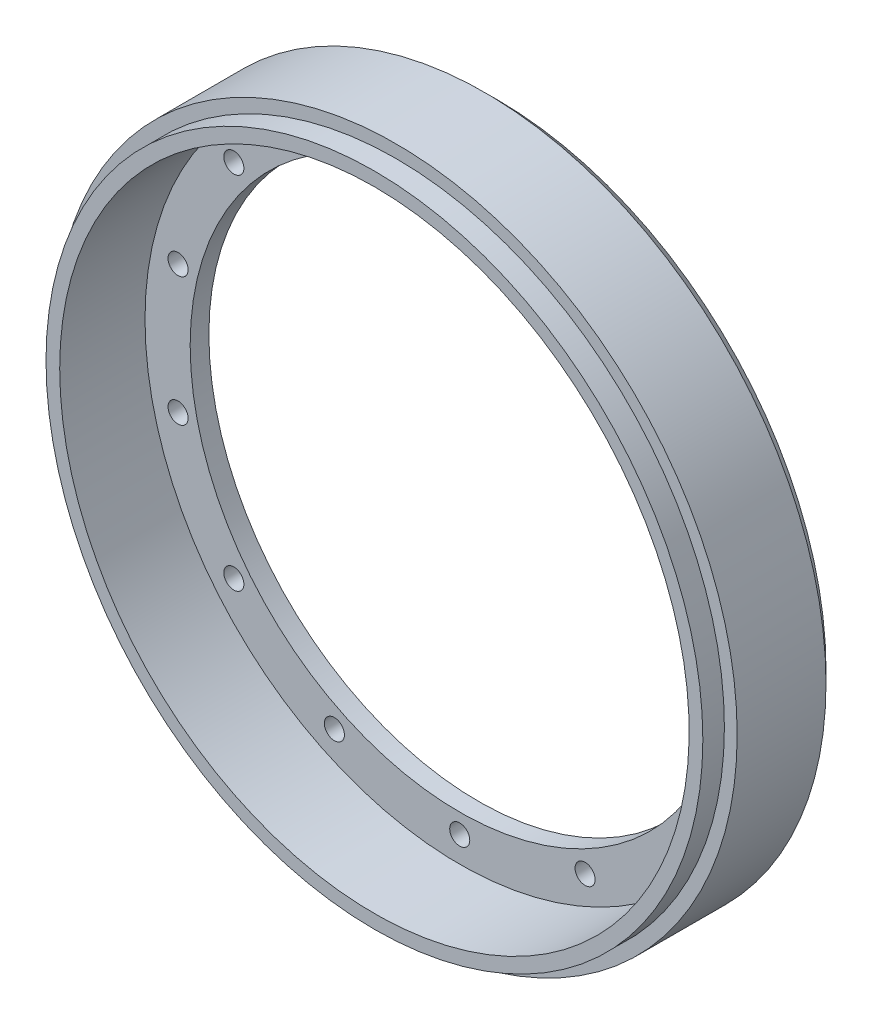
ISO-10303-21;
HEADER;
FILE_DESCRIPTION(('STEP AP214'),'2;1');
FILE_NAME('part.step','',(''),(''),'','','');
FILE_SCHEMA(('AUTOMOTIVE_DESIGN { 1 0 10303 214 1 1 1 1 }'));
ENDSEC;
DATA;
#1=APPLICATION_CONTEXT('core data for automotive mechanical design processes');
#2=APPLICATION_PROTOCOL_DEFINITION('international standard','automotive_design',2000,#1);
#3=PRODUCT_CONTEXT('',#1,'mechanical');
#4=PRODUCT('Part','Part','',(#3));
#5=PRODUCT_RELATED_PRODUCT_CATEGORY('part','',(#4));
#6=PRODUCT_DEFINITION_FORMATION('','',#4);
#7=PRODUCT_DEFINITION_CONTEXT('part definition',#1,'design');
#8=PRODUCT_DEFINITION('design','',#6,#7);
#9=PRODUCT_DEFINITION_SHAPE('','',#8);
#10=(LENGTH_UNIT() NAMED_UNIT(*) SI_UNIT(.MILLI.,.METRE.));
#11=(NAMED_UNIT(*) PLANE_ANGLE_UNIT() SI_UNIT($,.RADIAN.));
#12=(NAMED_UNIT(*) SI_UNIT($,.STERADIAN.) SOLID_ANGLE_UNIT());
#13=UNCERTAINTY_MEASURE_WITH_UNIT(LENGTH_MEASURE(1.E-05),#10,'distance_accuracy_value','');
#14=(GEOMETRIC_REPRESENTATION_CONTEXT(3) GLOBAL_UNCERTAINTY_ASSIGNED_CONTEXT((#13)) GLOBAL_UNIT_ASSIGNED_CONTEXT((#10,
#11,#12)) REPRESENTATION_CONTEXT('',''));
#15=CARTESIAN_POINT('',(0.,0.,0.));
#16=DIRECTION('',(0.,0.,1.));
#17=DIRECTION('',(1.,0.,0.));
#18=AXIS2_PLACEMENT_3D('',#15,#16,#17);
#19=CARTESIAN_POINT('',(0.,0.,-19.59811));
#20=DIRECTION('',(0.,0.,1.));
#21=DIRECTION('',(0.,-1.,0.));
#22=AXIS2_PLACEMENT_3D('',#19,#20,#21);
#23=CYLINDRICAL_SURFACE('',#22,36.);
#24=CARTESIAN_POINT('',(0.,1.00060618014514E-11,13.40189000001));
#25=DIRECTION('',(0.,-2.77961468730774E-13,-1.));
#26=DIRECTION('',(0.,1.,-2.77961468730774E-13));
#27=AXIS2_PLACEMENT_3D('',#24,#25,#26);
#28=CIRCLE('',#27,36.00000000001);
#29=CARTESIAN_POINT('',(0.,36.00000000002,13.40189));
#30=VERTEX_POINT('',#29);
#31=EDGE_CURVE('E23',#30,#30,#28,.T.);
#32=ORIENTED_EDGE('',*,*,#31,.T.);
#33=EDGE_LOOP('',(#32));
#34=FACE_BOUND('',#33,.T.);
#35=CARTESIAN_POINT('',(0.,0.,11.0378241017055));
#36=DIRECTION('',(0.,0.,1.));
#37=DIRECTION('',(1.,0.,0.));
#38=AXIS2_PLACEMENT_3D('',#35,#36,#37);
#39=CIRCLE('',#38,36.);
#40=CARTESIAN_POINT('',(36.,0.,11.0378241017055));
#41=VERTEX_POINT('',#40);
#42=EDGE_CURVE('E169',#41,#41,#39,.T.);
#43=ORIENTED_EDGE('',*,*,#42,.T.);
#44=EDGE_LOOP('',(#43));
#45=FACE_BOUND('',#44,.T.);
#46=ADVANCED_FACE('F14',(#34,#45),#23,.T.);
#47=CARTESIAN_POINT('',(1.52655665885959E-13,-1.22169108247785E-13,1.85000049103737));
#48=DIRECTION('',(0.,0.,1.));
#49=DIRECTION('',(1.,0.,0.));
#50=AXIS2_PLACEMENT_3D('',#47,#48,#49);
#51=CYLINDRICAL_SURFACE('',#50,29.55);
#52=CARTESIAN_POINT('',(0.,0.,2.00000049103736));
#53=DIRECTION('',(0.,0.,-1.));
#54=DIRECTION('',(-1.,0.,0.));
#55=AXIS2_PLACEMENT_3D('',#52,#53,#54);
#56=CIRCLE('',#55,29.55);
#57=CARTESIAN_POINT('',(-29.55,0.,2.00000049103736));
#58=VERTEX_POINT('',#57);
#59=EDGE_CURVE('E146',#58,#58,#56,.T.);
#60=ORIENTED_EDGE('',*,*,#59,.T.);
#61=EDGE_LOOP('',(#60));
#62=FACE_BOUND('',#61,.T.);
#63=CARTESIAN_POINT('',(0.,0.,4.05000049103737));
#64=DIRECTION('',(0.,0.,-1.));
#65=DIRECTION('',(-1.,0.,0.));
#66=AXIS2_PLACEMENT_3D('',#63,#64,#65);
#67=CIRCLE('',#66,29.55);
#68=CARTESIAN_POINT('',(-29.55,0.,4.05000049103737));
#69=VERTEX_POINT('',#68);
#70=EDGE_CURVE('E161',#69,#69,#67,.T.);
#71=ORIENTED_EDGE('',*,*,#70,.F.);
#72=EDGE_LOOP('',(#71));
#73=FACE_BOUND('',#72,.T.);
#74=ADVANCED_FACE('F196',(#62,#73),#51,.F.);
#75=CARTESIAN_POINT('',(-32.025000000005,0.,2.00000049103736));
#76=DIRECTION('',(0.,0.,1.));
#77=DIRECTION('',(1.,0.,0.));
#78=AXIS2_PLACEMENT_3D('',#75,#76,#77);
#79=PLANE('',#78);
#80=CARTESIAN_POINT('',(-24.7606030497625,19.7459220248661,2.00000049103736));
#81=DIRECTION('',(0.,0.,1.));
#82=DIRECTION('',(1.,0.,0.));
#83=AXIS2_PLACEMENT_3D('',#80,#81,#82);
#84=CIRCLE('',#83,1.1);
#85=CARTESIAN_POINT('',(-23.6606030497625,19.7459220248661,2.00000049103736));
#86=VERTEX_POINT('',#85);
#87=EDGE_CURVE('E102',#86,#86,#84,.F.);
#88=ORIENTED_EDGE('',*,*,#87,.F.);
#89=EDGE_LOOP('',(#88));
#90=FACE_BOUND('',#89,.T.);
#91=CARTESIAN_POINT('',(-30.8759669787983,7.0472379783965,2.00000049103736));
#92=DIRECTION('',(0.,0.,1.));
#93=DIRECTION('',(1.,0.,0.));
#94=AXIS2_PLACEMENT_3D('',#91,#92,#93);
#95=CIRCLE('',#94,1.1);
#96=CARTESIAN_POINT('',(-29.7759669787983,7.0472379783965,2.00000049103736));
#97=VERTEX_POINT('',#96);
#98=EDGE_CURVE('E106',#97,#97,#95,.T.);
#99=ORIENTED_EDGE('',*,*,#98,.T.);
#100=EDGE_LOOP('',(#99));
#101=FACE_BOUND('',#100,.T.);
#102=CARTESIAN_POINT('',(-13.7410980178531,-28.5336840464696,2.00000049103736));
#103=DIRECTION('',(0.,0.,1.));
#104=DIRECTION('',(1.,0.,0.));
#105=AXIS2_PLACEMENT_3D('',#102,#103,#104);
#106=CIRCLE('',#105,1.1);
#107=CARTESIAN_POINT('',(-12.6410980178531,-28.5336840464696,2.00000049103736));
#108=VERTEX_POINT('',#107);
#109=EDGE_CURVE('E118',#108,#108,#106,.F.);
#110=ORIENTED_EDGE('',*,*,#109,.F.);
#111=EDGE_LOOP('',(#110));
#112=FACE_BOUND('',#111,.T.);
#113=CARTESIAN_POINT('',(0.,-31.67,2.00000049103736));
#114=DIRECTION('',(0.,0.,1.));
#115=DIRECTION('',(1.,0.,0.));
#116=AXIS2_PLACEMENT_3D('',#113,#114,#115);
#117=CIRCLE('',#116,1.1);
#118=CARTESIAN_POINT('',(1.09999999999998,-31.67,2.00000049103736));
#119=VERTEX_POINT('',#118);
#120=EDGE_CURVE('E122',#119,#119,#117,.T.);
#121=ORIENTED_EDGE('',*,*,#120,.T.);
#122=EDGE_LOOP('',(#121));
#123=FACE_BOUND('',#122,.T.);
#124=CARTESIAN_POINT('',(30.8759669787983,-7.04723797839648,2.00000049103736));
#125=DIRECTION('',(0.,0.,1.));
#126=DIRECTION('',(1.,0.,0.));
#127=AXIS2_PLACEMENT_3D('',#124,#125,#126);
#128=CIRCLE('',#127,1.1);
#129=CARTESIAN_POINT('',(31.9759669787984,-7.04723797839648,2.00000049103736));
#130=VERTEX_POINT('',#129);
#131=EDGE_CURVE('E134',#130,#130,#128,.F.);
#132=ORIENTED_EDGE('',*,*,#131,.F.);
#133=EDGE_LOOP('',(#132));
#134=FACE_BOUND('',#133,.T.);
#135=CARTESIAN_POINT('',(30.8759669787983,7.04723797839646,2.00000049103736));
#136=DIRECTION('',(0.,0.,1.));
#137=DIRECTION('',(1.,0.,0.));
#138=AXIS2_PLACEMENT_3D('',#135,#136,#137);
#139=CIRCLE('',#138,1.1);
#140=CARTESIAN_POINT('',(31.9759669787984,7.04723797839646,2.00000049103736));
#141=VERTEX_POINT('',#140);
#142=EDGE_CURVE('E138',#141,#141,#139,.T.);
#143=ORIENTED_EDGE('',*,*,#142,.T.);
#144=EDGE_LOOP('',(#143));
#145=FACE_BOUND('',#144,.T.);
#146=CARTESIAN_POINT('',(0.,0.,2.00000049103736));
#147=DIRECTION('',(0.,0.,-1.));
#148=DIRECTION('',(-1.,0.,0.));
#149=AXIS2_PLACEMENT_3D('',#146,#147,#148);
#150=CIRCLE('',#149,34.50000000001);
#151=CARTESIAN_POINT('',(-34.50000000001,0.,2.00000049103736));
#152=VERTEX_POINT('',#151);
#153=EDGE_CURVE('E150',#152,#152,#150,.T.);
#154=ORIENTED_EDGE('',*,*,#153,.T.);
#155=EDGE_LOOP('',(#154));
#156=FACE_BOUND('',#155,.T.);
#157=ORIENTED_EDGE('',*,*,#59,.F.);
#158=EDGE_LOOP('',(#157));
#159=FACE_BOUND('',#158,.T.);
#160=CARTESIAN_POINT('',(24.7606030497625,19.7459220248661,2.00000049103736));
#161=DIRECTION('',(0.,0.,1.));
#162=DIRECTION('',(1.,0.,0.));
#163=AXIS2_PLACEMENT_3D('',#160,#161,#162);
#164=CIRCLE('',#163,1.1);
#165=CARTESIAN_POINT('',(25.8606030497625,19.7459220248661,2.00000049103736));
#166=VERTEX_POINT('',#165);
#167=EDGE_CURVE('E142',#166,#166,#164,.F.);
#168=ORIENTED_EDGE('',*,*,#167,.F.);
#169=EDGE_LOOP('',(#168));
#170=FACE_BOUND('',#169,.T.);
#171=CARTESIAN_POINT('',(24.7606030497625,-19.7459220248661,2.00000049103736));
#172=DIRECTION('',(0.,0.,1.));
#173=DIRECTION('',(1.,0.,0.));
#174=AXIS2_PLACEMENT_3D('',#171,#172,#173);
#175=CIRCLE('',#174,1.1);
#176=CARTESIAN_POINT('',(25.8606030497625,-19.7459220248661,2.00000049103736));
#177=VERTEX_POINT('',#176);
#178=EDGE_CURVE('E130',#177,#177,#175,.T.);
#179=ORIENTED_EDGE('',*,*,#178,.T.);
#180=EDGE_LOOP('',(#179));
#181=FACE_BOUND('',#180,.T.);
#182=CARTESIAN_POINT('',(13.7410980178531,-28.5336840464696,2.00000049103736));
#183=DIRECTION('',(0.,0.,1.));
#184=DIRECTION('',(1.,0.,0.));
#185=AXIS2_PLACEMENT_3D('',#182,#183,#184);
#186=CIRCLE('',#185,1.1);
#187=CARTESIAN_POINT('',(14.8410980178531,-28.5336840464696,2.00000049103736));
#188=VERTEX_POINT('',#187);
#189=EDGE_CURVE('E126',#188,#188,#186,.F.);
#190=ORIENTED_EDGE('',*,*,#189,.F.);
#191=EDGE_LOOP('',(#190));
#192=FACE_BOUND('',#191,.T.);
#193=CARTESIAN_POINT('',(-24.7606030497625,-19.7459220248661,2.00000049103736));
#194=DIRECTION('',(0.,0.,1.));
#195=DIRECTION('',(1.,0.,0.));
#196=AXIS2_PLACEMENT_3D('',#193,#194,#195);
#197=CIRCLE('',#196,1.1);
#198=CARTESIAN_POINT('',(-23.6606030497625,-19.7459220248661,2.00000049103736));
#199=VERTEX_POINT('',#198);
#200=EDGE_CURVE('E114',#199,#199,#197,.T.);
#201=ORIENTED_EDGE('',*,*,#200,.T.);
#202=EDGE_LOOP('',(#201));
#203=FACE_BOUND('',#202,.T.);
#204=CARTESIAN_POINT('',(-30.8759669787983,-7.04723797839648,2.00000049103736));
#205=DIRECTION('',(0.,0.,1.));
#206=DIRECTION('',(1.,0.,0.));
#207=AXIS2_PLACEMENT_3D('',#204,#205,#206);
#208=CIRCLE('',#207,1.1);
#209=CARTESIAN_POINT('',(-29.7759669787983,-7.04723797839648,2.00000049103736));
#210=VERTEX_POINT('',#209);
#211=EDGE_CURVE('E110',#210,#210,#208,.F.);
#212=ORIENTED_EDGE('',*,*,#211,.F.);
#213=EDGE_LOOP('',(#212));
#214=FACE_BOUND('',#213,.T.);
#215=CARTESIAN_POINT('',(-13.741098017853,28.5336840464697,2.00000049103736));
#216=DIRECTION('',(0.,0.,1.));
#217=DIRECTION('',(1.,0.,0.));
#218=AXIS2_PLACEMENT_3D('',#215,#216,#217);
#219=CIRCLE('',#218,1.1);
#220=CARTESIAN_POINT('',(-12.641098017853,28.5336840464697,2.00000049103736));
#221=VERTEX_POINT('',#220);
#222=EDGE_CURVE('E98',#221,#221,#219,.T.);
#223=ORIENTED_EDGE('',*,*,#222,.T.);
#224=EDGE_LOOP('',(#223));
#225=FACE_BOUND('',#224,.T.);
#226=CARTESIAN_POINT('',(13.7410980178531,28.5336840464696,2.00000049103736));
#227=DIRECTION('',(0.,0.,1.));
#228=DIRECTION('',(1.,0.,0.));
#229=AXIS2_PLACEMENT_3D('',#226,#227,#228);
#230=CIRCLE('',#229,1.1);
#231=CARTESIAN_POINT('',(14.8410980178531,28.5336840464696,2.00000049103736));
#232=VERTEX_POINT('',#231);
#233=EDGE_CURVE('E94',#232,#232,#230,.T.);
#234=ORIENTED_EDGE('',*,*,#233,.T.);
#235=EDGE_LOOP('',(#234));
#236=FACE_BOUND('',#235,.T.);
#237=CARTESIAN_POINT('',(0.,31.67,2.00000049103736));
#238=DIRECTION('',(0.,0.,1.));
#239=DIRECTION('',(1.,0.,0.));
#240=AXIS2_PLACEMENT_3D('',#237,#238,#239);
#241=CIRCLE('',#240,1.1);
#242=CARTESIAN_POINT('',(1.1,31.67,2.00000049103736));
#243=VERTEX_POINT('',#242);
#244=EDGE_CURVE('E90',#243,#243,#241,.F.);
#245=ORIENTED_EDGE('',*,*,#244,.F.);
#246=EDGE_LOOP('',(#245));
#247=FACE_BOUND('',#246,.T.);
#248=ADVANCED_FACE('F202',(#90,#101,#112,#123,#134,#145,#156,#159,#170,#181,#192,#203,#214,#225,
#236,#247),#79,.F.);
#249=CARTESIAN_POINT('',(0.,0.,-10.8740547544813));
#250=DIRECTION('',(0.,0.,-1.));
#251=DIRECTION('',(-1.,0.,0.));
#252=AXIS2_PLACEMENT_3D('',#249,#250,#251);
#253=CYLINDRICAL_SURFACE('',#252,34.50000000001);
#254=ORIENTED_EDGE('',*,*,#153,.F.);
#255=EDGE_LOOP('',(#254));
#256=FACE_BOUND('',#255,.T.);
#257=CARTESIAN_POINT('',(0.,0.,4.91037363548053E-07));
#258=DIRECTION('',(0.,0.,-1.));
#259=DIRECTION('',(-1.,0.,0.));
#260=AXIS2_PLACEMENT_3D('',#257,#258,#259);
#261=CIRCLE('',#260,34.50000000001);
#262=CARTESIAN_POINT('',(-34.50000000001,0.,4.91037363548053E-07));
#263=VERTEX_POINT('',#262);
#264=EDGE_CURVE('E154',#263,#263,#261,.T.);
#265=ORIENTED_EDGE('',*,*,#264,.T.);
#266=EDGE_LOOP('',(#265));
#267=FACE_BOUND('',#266,.T.);
#268=ADVANCED_FACE('F325',(#256,#267),#253,.F.);
#269=CARTESIAN_POINT('',(-35.25000000001,0.,4.91037363548053E-07));
#270=DIRECTION('',(0.,0.,1.));
#271=DIRECTION('',(1.,0.,0.));
#272=AXIS2_PLACEMENT_3D('',#269,#270,#271);
#273=PLANE('',#272);
#274=CARTESIAN_POINT('',(0.,0.,4.91037363548053E-07));
#275=DIRECTION('',(0.,0.,1.));
#276=DIRECTION('',(1.,0.,0.));
#277=AXIS2_PLACEMENT_3D('',#274,#275,#276);
#278=CIRCLE('',#277,36.0981104910374);
#279=CARTESIAN_POINT('',(36.0981104910374,0.,4.91037363548053E-07));
#280=VERTEX_POINT('',#279);
#281=EDGE_CURVE('E18',#280,#280,#278,.F.);
#282=ORIENTED_EDGE('',*,*,#281,.T.);
#283=EDGE_LOOP('',(#282));
#284=FACE_BOUND('',#283,.T.);
#285=ORIENTED_EDGE('',*,*,#264,.F.);
#286=EDGE_LOOP('',(#285));
#287=FACE_BOUND('',#286,.T.);
#288=ADVANCED_FACE('F277',(#284,#287),#273,.F.);
#289=CARTESIAN_POINT('',(-32.025000000005,0.,4.05000049103737));
#290=DIRECTION('',(0.,0.,1.));
#291=DIRECTION('',(1.,0.,0.));
#292=AXIS2_PLACEMENT_3D('',#289,#290,#291);
#293=PLANE('',#292);
#294=CARTESIAN_POINT('',(13.7410980178531,28.5336840464696,4.05000049103737));
#295=DIRECTION('',(0.,0.,1.));
#296=DIRECTION('',(1.,0.,0.));
#297=AXIS2_PLACEMENT_3D('',#294,#295,#296);
#298=CIRCLE('',#297,1.1);
#299=CARTESIAN_POINT('',(14.8410980178531,28.5336840464696,4.05000049103737));
#300=VERTEX_POINT('',#299);
#301=EDGE_CURVE('E38',#300,#300,#298,.T.);
#302=ORIENTED_EDGE('',*,*,#301,.F.);
#303=EDGE_LOOP('',(#302));
#304=FACE_BOUND('',#303,.T.);
#305=CARTESIAN_POINT('',(-13.741098017853,28.5336840464697,4.05000049103737));
#306=DIRECTION('',(0.,0.,1.));
#307=DIRECTION('',(1.,0.,0.));
#308=AXIS2_PLACEMENT_3D('',#305,#306,#307);
#309=CIRCLE('',#308,1.1);
#310=CARTESIAN_POINT('',(-12.641098017853,28.5336840464697,4.05000049103737));
#311=VERTEX_POINT('',#310);
#312=EDGE_CURVE('E42',#311,#311,#309,.T.);
#313=ORIENTED_EDGE('',*,*,#312,.F.);
#314=EDGE_LOOP('',(#313));
#315=FACE_BOUND('',#314,.T.);
#316=CARTESIAN_POINT('',(-30.8759669787983,7.0472379783965,4.05000049103737));
#317=DIRECTION('',(0.,0.,1.));
#318=DIRECTION('',(1.,0.,0.));
#319=AXIS2_PLACEMENT_3D('',#316,#317,#318);
#320=CIRCLE('',#319,1.1);
#321=CARTESIAN_POINT('',(-29.7759669787983,7.0472379783965,4.05000049103737));
#322=VERTEX_POINT('',#321);
#323=EDGE_CURVE('E50',#322,#322,#320,.T.);
#324=ORIENTED_EDGE('',*,*,#323,.F.);
#325=EDGE_LOOP('',(#324));
#326=FACE_BOUND('',#325,.T.);
#327=CARTESIAN_POINT('',(-24.7606030497625,-19.7459220248661,4.05000049103737));
#328=DIRECTION('',(0.,0.,1.));
#329=DIRECTION('',(1.,0.,0.));
#330=AXIS2_PLACEMENT_3D('',#327,#328,#329);
#331=CIRCLE('',#330,1.1);
#332=CARTESIAN_POINT('',(-23.6606030497625,-19.7459220248661,4.05000049103737));
#333=VERTEX_POINT('',#332);
#334=EDGE_CURVE('E58',#333,#333,#331,.T.);
#335=ORIENTED_EDGE('',*,*,#334,.F.);
#336=EDGE_LOOP('',(#335));
#337=FACE_BOUND('',#336,.T.);
#338=CARTESIAN_POINT('',(0.,-31.67,4.05000049103737));
#339=DIRECTION('',(0.,0.,1.));
#340=DIRECTION('',(1.,0.,0.));
#341=AXIS2_PLACEMENT_3D('',#338,#339,#340);
#342=CIRCLE('',#341,1.1);
#343=CARTESIAN_POINT('',(1.09999999999998,-31.67,4.05000049103737));
#344=VERTEX_POINT('',#343);
#345=EDGE_CURVE('E66',#344,#344,#342,.T.);
#346=ORIENTED_EDGE('',*,*,#345,.F.);
#347=EDGE_LOOP('',(#346));
#348=FACE_BOUND('',#347,.T.);
#349=CARTESIAN_POINT('',(24.7606030497625,-19.7459220248661,4.05000049103737));
#350=DIRECTION('',(0.,0.,1.));
#351=DIRECTION('',(1.,0.,0.));
#352=AXIS2_PLACEMENT_3D('',#349,#350,#351);
#353=CIRCLE('',#352,1.1);
#354=CARTESIAN_POINT('',(25.8606030497625,-19.7459220248661,4.05000049103737));
#355=VERTEX_POINT('',#354);
#356=EDGE_CURVE('E74',#355,#355,#353,.T.);
#357=ORIENTED_EDGE('',*,*,#356,.F.);
#358=EDGE_LOOP('',(#357));
#359=FACE_BOUND('',#358,.T.);
#360=CARTESIAN_POINT('',(30.8759669787983,7.04723797839646,4.05000049103737));
#361=DIRECTION('',(0.,0.,1.));
#362=DIRECTION('',(1.,0.,0.));
#363=AXIS2_PLACEMENT_3D('',#360,#361,#362);
#364=CIRCLE('',#363,1.1);
#365=CARTESIAN_POINT('',(31.9759669787984,7.04723797839646,4.05000049103737));
#366=VERTEX_POINT('',#365);
#367=EDGE_CURVE('E82',#366,#366,#364,.T.);
#368=ORIENTED_EDGE('',*,*,#367,.F.);
#369=EDGE_LOOP('',(#368));
#370=FACE_BOUND('',#369,.T.);
#371=ORIENTED_EDGE('',*,*,#70,.T.);
#372=EDGE_LOOP('',(#371));
#373=FACE_BOUND('',#372,.T.);
#374=CARTESIAN_POINT('',(0.,0.,4.05000049103737));
#375=DIRECTION('',(0.,0.,-1.));
#376=DIRECTION('',(-1.,0.,0.));
#377=AXIS2_PLACEMENT_3D('',#374,#375,#376);
#378=CIRCLE('',#377,34.50000000001);
#379=CARTESIAN_POINT('',(-34.50000000001,0.,4.05000049103737));
#380=VERTEX_POINT('',#379);
#381=EDGE_CURVE('E157',#380,#380,#378,.T.);
#382=ORIENTED_EDGE('',*,*,#381,.F.);
#383=EDGE_LOOP('',(#382));
#384=FACE_BOUND('',#383,.T.);
#385=CARTESIAN_POINT('',(24.7606030497625,19.7459220248661,4.05000049103737));
#386=DIRECTION('',(0.,0.,1.));
#387=DIRECTION('',(1.,0.,0.));
#388=AXIS2_PLACEMENT_3D('',#385,#386,#387);
#389=CIRCLE('',#388,1.1);
#390=CARTESIAN_POINT('',(25.8606030497625,19.7459220248661,4.05000049103737));
#391=VERTEX_POINT('',#390);
#392=EDGE_CURVE('E86',#391,#391,#389,.F.);
#393=ORIENTED_EDGE('',*,*,#392,.T.);
#394=EDGE_LOOP('',(#393));
#395=FACE_BOUND('',#394,.T.);
#396=CARTESIAN_POINT('',(30.8759669787983,-7.04723797839648,4.05000049103737));
#397=DIRECTION('',(0.,0.,1.));
#398=DIRECTION('',(1.,0.,0.));
#399=AXIS2_PLACEMENT_3D('',#396,#397,#398);
#400=CIRCLE('',#399,1.1);
#401=CARTESIAN_POINT('',(31.9759669787984,-7.04723797839648,4.05000049103737));
#402=VERTEX_POINT('',#401);
#403=EDGE_CURVE('E78',#402,#402,#400,.F.);
#404=ORIENTED_EDGE('',*,*,#403,.T.);
#405=EDGE_LOOP('',(#404));
#406=FACE_BOUND('',#405,.T.);
#407=CARTESIAN_POINT('',(13.7410980178531,-28.5336840464696,4.05000049103737));
#408=DIRECTION('',(0.,0.,1.));
#409=DIRECTION('',(1.,0.,0.));
#410=AXIS2_PLACEMENT_3D('',#407,#408,#409);
#411=CIRCLE('',#410,1.1);
#412=CARTESIAN_POINT('',(14.8410980178531,-28.5336840464696,4.05000049103737));
#413=VERTEX_POINT('',#412);
#414=EDGE_CURVE('E70',#413,#413,#411,.F.);
#415=ORIENTED_EDGE('',*,*,#414,.T.);
#416=EDGE_LOOP('',(#415));
#417=FACE_BOUND('',#416,.T.);
#418=CARTESIAN_POINT('',(-13.7410980178531,-28.5336840464696,4.05000049103737));
#419=DIRECTION('',(0.,0.,1.));
#420=DIRECTION('',(1.,0.,0.));
#421=AXIS2_PLACEMENT_3D('',#418,#419,#420);
#422=CIRCLE('',#421,1.1);
#423=CARTESIAN_POINT('',(-12.6410980178531,-28.5336840464696,4.05000049103737));
#424=VERTEX_POINT('',#423);
#425=EDGE_CURVE('E62',#424,#424,#422,.F.);
#426=ORIENTED_EDGE('',*,*,#425,.T.);
#427=EDGE_LOOP('',(#426));
#428=FACE_BOUND('',#427,.T.);
#429=CARTESIAN_POINT('',(-30.8759669787983,-7.04723797839648,4.05000049103737));
#430=DIRECTION('',(0.,0.,1.));
#431=DIRECTION('',(1.,0.,0.));
#432=AXIS2_PLACEMENT_3D('',#429,#430,#431);
#433=CIRCLE('',#432,1.1);
#434=CARTESIAN_POINT('',(-29.7759669787983,-7.04723797839648,4.05000049103737));
#435=VERTEX_POINT('',#434);
#436=EDGE_CURVE('E54',#435,#435,#433,.F.);
#437=ORIENTED_EDGE('',*,*,#436,.T.);
#438=EDGE_LOOP('',(#437));
#439=FACE_BOUND('',#438,.T.);
#440=CARTESIAN_POINT('',(-24.7606030497625,19.7459220248661,4.05000049103737));
#441=DIRECTION('',(0.,0.,1.));
#442=DIRECTION('',(1.,0.,0.));
#443=AXIS2_PLACEMENT_3D('',#440,#441,#442);
#444=CIRCLE('',#443,1.1);
#445=CARTESIAN_POINT('',(-23.6606030497625,19.7459220248661,4.05000049103737));
#446=VERTEX_POINT('',#445);
#447=EDGE_CURVE('E46',#446,#446,#444,.F.);
#448=ORIENTED_EDGE('',*,*,#447,.T.);
#449=EDGE_LOOP('',(#448));
#450=FACE_BOUND('',#449,.T.);
#451=CARTESIAN_POINT('',(0.,31.67,4.05000049103737));
#452=DIRECTION('',(0.,0.,1.));
#453=DIRECTION('',(1.,0.,0.));
#454=AXIS2_PLACEMENT_3D('',#451,#452,#453);
#455=CIRCLE('',#454,1.1);
#456=CARTESIAN_POINT('',(1.1,31.67,4.05000049103737));
#457=VERTEX_POINT('',#456);
#458=EDGE_CURVE('E34',#457,#457,#455,.F.);
#459=ORIENTED_EDGE('',*,*,#458,.T.);
#460=EDGE_LOOP('',(#459));
#461=FACE_BOUND('',#460,.T.);
#462=ADVANCED_FACE('F216',(#304,#315,#326,#337,#348,#359,#370,#373,#384,#395,#406,#417,#428,
#439,#450,#461),#293,.T.);
#463=CARTESIAN_POINT('',(0.,0.,-0.0981099999999985));
#464=DIRECTION('',(0.,0.,1.));
#465=DIRECTION('',(0.,1.,0.));
#466=AXIS2_PLACEMENT_3D('',#463,#464,#465);
#467=CONICAL_SURFACE('',#466,36.,0.785398163397448);
#468=CARTESIAN_POINT('',(0.,0.,1.30189000001001));
#469=DIRECTION('',(0.,0.,1.));
#470=DIRECTION('',(0.,-1.,0.));
#471=AXIS2_PLACEMENT_3D('',#468,#469,#470);
#472=CIRCLE('',#471,37.40000000001);
#473=CARTESIAN_POINT('',(0.,-37.40000000001,1.30189000001001));
#474=VERTEX_POINT('',#473);
#475=EDGE_CURVE('E165',#474,#474,#472,.T.);
#476=ORIENTED_EDGE('',*,*,#475,.F.);
#477=EDGE_LOOP('',(#476));
#478=FACE_BOUND('',#477,.T.);
#479=ORIENTED_EDGE('',*,*,#281,.F.);
#480=EDGE_LOOP('',(#479));
#481=FACE_BOUND('',#480,.T.);
#482=ADVANCED_FACE('F212',(#478,#481),#467,.T.);
#483=CARTESIAN_POINT('',(-24.85,0.,13.40189));
#484=DIRECTION('',(0.,0.,-1.));
#485=DIRECTION('',(0.,-1.,0.));
#486=AXIS2_PLACEMENT_3D('',#483,#484,#485);
#487=PLANE('',#486);
#488=ORIENTED_EDGE('',*,*,#31,.F.);
#489=EDGE_LOOP('',(#488));
#490=FACE_BOUND('',#489,.T.);
#491=CARTESIAN_POINT('',(0.,1.00060618014514E-11,13.40189000001));
#492=DIRECTION('',(0.,2.90038763416758E-13,1.));
#493=DIRECTION('',(0.,1.,-2.90038763416758E-13));
#494=AXIS2_PLACEMENT_3D('',#491,#492,#493);
#495=CIRCLE('',#494,34.50000000001);
#496=CARTESIAN_POINT('',(0.,34.50000000002,13.40189));
#497=VERTEX_POINT('',#496);
#498=EDGE_CURVE('E10',#497,#497,#495,.T.);
#499=ORIENTED_EDGE('',*,*,#498,.F.);
#500=EDGE_LOOP('',(#499));
#501=FACE_BOUND('',#500,.T.);
#502=ADVANCED_FACE('F208',(#490,#501),#487,.F.);
#503=CARTESIAN_POINT('',(0.,0.,-19.59811));
#504=DIRECTION('',(0.,0.,1.));
#505=DIRECTION('',(0.,-1.,0.));
#506=AXIS2_PLACEMENT_3D('',#503,#504,#505);
#507=CYLINDRICAL_SURFACE('',#506,34.5);
#508=ORIENTED_EDGE('',*,*,#498,.T.);
#509=EDGE_LOOP('',(#508));
#510=FACE_BOUND('',#509,.T.);
#511=ORIENTED_EDGE('',*,*,#381,.T.);
#512=EDGE_LOOP('',(#511));
#513=FACE_BOUND('',#512,.T.);
#514=ADVANCED_FACE('F211',(#510,#513),#507,.F.);
#515=CARTESIAN_POINT('',(24.7606030497625,19.7459220248661,13.40189));
#516=DIRECTION('',(0.,0.,-1.));
#517=DIRECTION('',(-0.623489801858733,0.78183148246803,0.));
#518=AXIS2_PLACEMENT_3D('',#515,#516,#517);
#519=CYLINDRICAL_SURFACE('',#518,1.1);
#520=ORIENTED_EDGE('',*,*,#167,.T.);
#521=EDGE_LOOP('',(#520));
#522=FACE_BOUND('',#521,.T.);
#523=ORIENTED_EDGE('',*,*,#392,.F.);
#524=EDGE_LOOP('',(#523));
#525=FACE_BOUND('',#524,.T.);
#526=ADVANCED_FACE('F220',(#522,#525),#519,.F.);
#527=CARTESIAN_POINT('',(30.8759669787983,7.04723797839646,13.40189));
#528=DIRECTION('',(0.,0.,-1.));
#529=DIRECTION('',(-0.222520933956315,-0.974927912181824,0.));
#530=AXIS2_PLACEMENT_3D('',#527,#528,#529);
#531=CYLINDRICAL_SURFACE('',#530,1.1);
#532=ORIENTED_EDGE('',*,*,#142,.F.);
#533=EDGE_LOOP('',(#532));
#534=FACE_BOUND('',#533,.T.);
#535=ORIENTED_EDGE('',*,*,#367,.T.);
#536=EDGE_LOOP('',(#535));
#537=FACE_BOUND('',#536,.T.);
#538=ADVANCED_FACE('F223',(#534,#537),#531,.F.);
#539=CARTESIAN_POINT('',(30.8759669787983,-7.04723797839648,13.40189));
#540=DIRECTION('',(0.,0.,-1.));
#541=DIRECTION('',(0.222520933956315,0.974927912181824,0.));
#542=AXIS2_PLACEMENT_3D('',#539,#540,#541);
#543=CYLINDRICAL_SURFACE('',#542,1.1);
#544=ORIENTED_EDGE('',*,*,#131,.T.);
#545=EDGE_LOOP('',(#544));
#546=FACE_BOUND('',#545,.T.);
#547=ORIENTED_EDGE('',*,*,#403,.F.);
#548=EDGE_LOOP('',(#547));
#549=FACE_BOUND('',#548,.T.);
#550=ADVANCED_FACE('F227',(#546,#549),#543,.F.);
#551=CARTESIAN_POINT('',(24.7606030497625,-19.7459220248661,13.40189));
#552=DIRECTION('',(0.,0.,-1.));
#553=DIRECTION('',(-0.900968867902419,-0.433883739117558,0.));
#554=AXIS2_PLACEMENT_3D('',#551,#552,#553);
#555=CYLINDRICAL_SURFACE('',#554,1.1);
#556=ORIENTED_EDGE('',*,*,#178,.F.);
#557=EDGE_LOOP('',(#556));
#558=FACE_BOUND('',#557,.T.);
#559=ORIENTED_EDGE('',*,*,#356,.T.);
#560=EDGE_LOOP('',(#559));
#561=FACE_BOUND('',#560,.T.);
#562=ADVANCED_FACE('F231',(#558,#561),#555,.F.);
#563=CARTESIAN_POINT('',(13.7410980178531,-28.5336840464696,13.40189));
#564=DIRECTION('',(0.,0.,-1.));
#565=DIRECTION('',(0.900968867902419,0.433883739117558,0.));
#566=AXIS2_PLACEMENT_3D('',#563,#564,#565);
#567=CYLINDRICAL_SURFACE('',#566,1.1);
#568=ORIENTED_EDGE('',*,*,#189,.T.);
#569=EDGE_LOOP('',(#568));
#570=FACE_BOUND('',#569,.T.);
#571=ORIENTED_EDGE('',*,*,#414,.F.);
#572=EDGE_LOOP('',(#571));
#573=FACE_BOUND('',#572,.T.);
#574=ADVANCED_FACE('F235',(#570,#573),#567,.F.);
#575=CARTESIAN_POINT('',(0.,-31.67,13.40189));
#576=DIRECTION('',(0.,0.,-1.));
#577=DIRECTION('',(-0.900968867902419,0.433883739117559,0.));
#578=AXIS2_PLACEMENT_3D('',#575,#576,#577);
#579=CYLINDRICAL_SURFACE('',#578,1.1);
#580=ORIENTED_EDGE('',*,*,#120,.F.);
#581=EDGE_LOOP('',(#580));
#582=FACE_BOUND('',#581,.T.);
#583=ORIENTED_EDGE('',*,*,#345,.T.);
#584=EDGE_LOOP('',(#583));
#585=FACE_BOUND('',#584,.T.);
#586=ADVANCED_FACE('F239',(#582,#585),#579,.F.);
#587=CARTESIAN_POINT('',(-13.7410980178531,-28.5336840464696,13.40189));
#588=DIRECTION('',(0.,0.,-1.));
#589=DIRECTION('',(0.900968867902419,-0.433883739117559,0.));
#590=AXIS2_PLACEMENT_3D('',#587,#588,#589);
#591=CYLINDRICAL_SURFACE('',#590,1.1);
#592=ORIENTED_EDGE('',*,*,#109,.T.);
#593=EDGE_LOOP('',(#592));
#594=FACE_BOUND('',#593,.T.);
#595=ORIENTED_EDGE('',*,*,#425,.F.);
#596=EDGE_LOOP('',(#595));
#597=FACE_BOUND('',#596,.T.);
#598=ADVANCED_FACE('F243',(#594,#597),#591,.F.);
#599=CARTESIAN_POINT('',(-24.7606030497625,-19.7459220248661,13.40189));
#600=DIRECTION('',(0.,0.,-1.));
#601=DIRECTION('',(-0.222520933956314,0.974927912181824,0.));
#602=AXIS2_PLACEMENT_3D('',#599,#600,#601);
#603=CYLINDRICAL_SURFACE('',#602,1.1);
#604=ORIENTED_EDGE('',*,*,#200,.F.);
#605=EDGE_LOOP('',(#604));
#606=FACE_BOUND('',#605,.T.);
#607=ORIENTED_EDGE('',*,*,#334,.T.);
#608=EDGE_LOOP('',(#607));
#609=FACE_BOUND('',#608,.T.);
#610=ADVANCED_FACE('F247',(#606,#609),#603,.F.);
#611=CARTESIAN_POINT('',(-30.8759669787983,-7.04723797839648,13.40189));
#612=DIRECTION('',(0.,0.,-1.));
#613=DIRECTION('',(0.222520933956315,-0.974927912181824,0.));
#614=AXIS2_PLACEMENT_3D('',#611,#612,#613);
#615=CYLINDRICAL_SURFACE('',#614,1.1);
#616=ORIENTED_EDGE('',*,*,#211,.T.);
#617=EDGE_LOOP('',(#616));
#618=FACE_BOUND('',#617,.T.);
#619=ORIENTED_EDGE('',*,*,#436,.F.);
#620=EDGE_LOOP('',(#619));
#621=FACE_BOUND('',#620,.T.);
#622=ADVANCED_FACE('F251',(#618,#621),#615,.F.);
#623=CARTESIAN_POINT('',(-30.8759669787983,7.0472379783965,13.40189));
#624=DIRECTION('',(0.,0.,-1.));
#625=DIRECTION('',(0.623489801858734,0.78183148246803,0.));
#626=AXIS2_PLACEMENT_3D('',#623,#624,#625);
#627=CYLINDRICAL_SURFACE('',#626,1.1);
#628=ORIENTED_EDGE('',*,*,#98,.F.);
#629=EDGE_LOOP('',(#628));
#630=FACE_BOUND('',#629,.T.);
#631=ORIENTED_EDGE('',*,*,#323,.T.);
#632=EDGE_LOOP('',(#631));
#633=FACE_BOUND('',#632,.T.);
#634=ADVANCED_FACE('F255',(#630,#633),#627,.F.);
#635=CARTESIAN_POINT('',(-24.7606030497625,19.7459220248661,13.40189));
#636=DIRECTION('',(0.,0.,-1.));
#637=DIRECTION('',(-0.623489801858734,-0.78183148246803,0.));
#638=AXIS2_PLACEMENT_3D('',#635,#636,#637);
#639=CYLINDRICAL_SURFACE('',#638,1.1);
#640=ORIENTED_EDGE('',*,*,#87,.T.);
#641=EDGE_LOOP('',(#640));
#642=FACE_BOUND('',#641,.T.);
#643=ORIENTED_EDGE('',*,*,#447,.F.);
#644=EDGE_LOOP('',(#643));
#645=FACE_BOUND('',#644,.T.);
#646=ADVANCED_FACE('F259',(#642,#645),#639,.F.);
#647=CARTESIAN_POINT('',(-13.741098017853,28.5336840464697,13.40189));
#648=DIRECTION('',(0.,0.,-1.));
#649=DIRECTION('',(1.,0.,0.));
#650=AXIS2_PLACEMENT_3D('',#647,#648,#649);
#651=CYLINDRICAL_SURFACE('',#650,1.1);
#652=ORIENTED_EDGE('',*,*,#222,.F.);
#653=EDGE_LOOP('',(#652));
#654=FACE_BOUND('',#653,.T.);
#655=ORIENTED_EDGE('',*,*,#312,.T.);
#656=EDGE_LOOP('',(#655));
#657=FACE_BOUND('',#656,.T.);
#658=ADVANCED_FACE('F263',(#654,#657),#651,.F.);
#659=CARTESIAN_POINT('',(13.7410980178531,28.5336840464696,13.40189));
#660=DIRECTION('',(0.,0.,-1.));
#661=DIRECTION('',(-1.,0.,0.));
#662=AXIS2_PLACEMENT_3D('',#659,#660,#661);
#663=CYLINDRICAL_SURFACE('',#662,1.1);
#664=ORIENTED_EDGE('',*,*,#233,.F.);
#665=EDGE_LOOP('',(#664));
#666=FACE_BOUND('',#665,.T.);
#667=ORIENTED_EDGE('',*,*,#301,.T.);
#668=EDGE_LOOP('',(#667));
#669=FACE_BOUND('',#668,.T.);
#670=ADVANCED_FACE('F192',(#666,#669),#663,.F.);
#671=CARTESIAN_POINT('',(0.,31.67,13.40189));
#672=DIRECTION('',(0.,0.,-1.));
#673=DIRECTION('',(-1.,0.,0.));
#674=AXIS2_PLACEMENT_3D('',#671,#672,#673);
#675=CYLINDRICAL_SURFACE('',#674,1.1);
#676=ORIENTED_EDGE('',*,*,#244,.T.);
#677=EDGE_LOOP('',(#676));
#678=FACE_BOUND('',#677,.T.);
#679=ORIENTED_EDGE('',*,*,#458,.F.);
#680=EDGE_LOOP('',(#679));
#681=FACE_BOUND('',#680,.T.);
#682=ADVANCED_FACE('F16',(#678,#681),#675,.F.);
#683=CARTESIAN_POINT('',(0.,0.,-10.8740547544813));
#684=DIRECTION('',(0.,0.,-1.));
#685=DIRECTION('',(-1.,0.,0.));
#686=AXIS2_PLACEMENT_3D('',#683,#684,#685);
#687=CYLINDRICAL_SURFACE('',#686,37.40000000001);
#688=ORIENTED_EDGE('',*,*,#475,.T.);
#689=EDGE_LOOP('',(#688));
#690=FACE_BOUND('',#689,.T.);
#691=CARTESIAN_POINT('',(0.,0.,11.0378241017055));
#692=DIRECTION('',(0.,0.,1.));
#693=DIRECTION('',(1.,0.,0.));
#694=AXIS2_PLACEMENT_3D('',#691,#692,#693);
#695=CIRCLE('',#694,37.40000000001);
#696=CARTESIAN_POINT('',(37.40000000001,0.,11.0378241017055));
#697=VERTEX_POINT('',#696);
#698=EDGE_CURVE('E173',#697,#697,#695,.T.);
#699=ORIENTED_EDGE('',*,*,#698,.F.);
#700=EDGE_LOOP('',(#699));
#701=FACE_BOUND('',#700,.T.);
#702=ADVANCED_FACE('F181',(#690,#701),#687,.T.);
#703=CARTESIAN_POINT('',(-36.700000000005,0.,11.0378241017055));
#704=DIRECTION('',(0.,0.,-1.));
#705=DIRECTION('',(-1.,0.,0.));
#706=AXIS2_PLACEMENT_3D('',#703,#704,#705);
#707=PLANE('',#706);
#708=ORIENTED_EDGE('',*,*,#42,.F.);
#709=EDGE_LOOP('',(#708));
#710=FACE_BOUND('',#709,.T.);
#711=ORIENTED_EDGE('',*,*,#698,.T.);
#712=EDGE_LOOP('',(#711));
#713=FACE_BOUND('',#712,.T.);
#714=ADVANCED_FACE('F179',(#710,#713),#707,.F.);
#715=CLOSED_SHELL('',(#46,#74,#248,#268,#288,#462,#482,#502,#514,#526,#538,#550,#562,#574,#586,
#598,#610,#622,#634,#646,#658,#670,#682,#702,#714));
#716=MANIFOLD_SOLID_BREP('B1',#715);
#717=ADVANCED_BREP_SHAPE_REPRESENTATION('',(#18,#716),#14);
#718=SHAPE_DEFINITION_REPRESENTATION(#9,#717);
ENDSEC;
END-ISO-10303-21;
